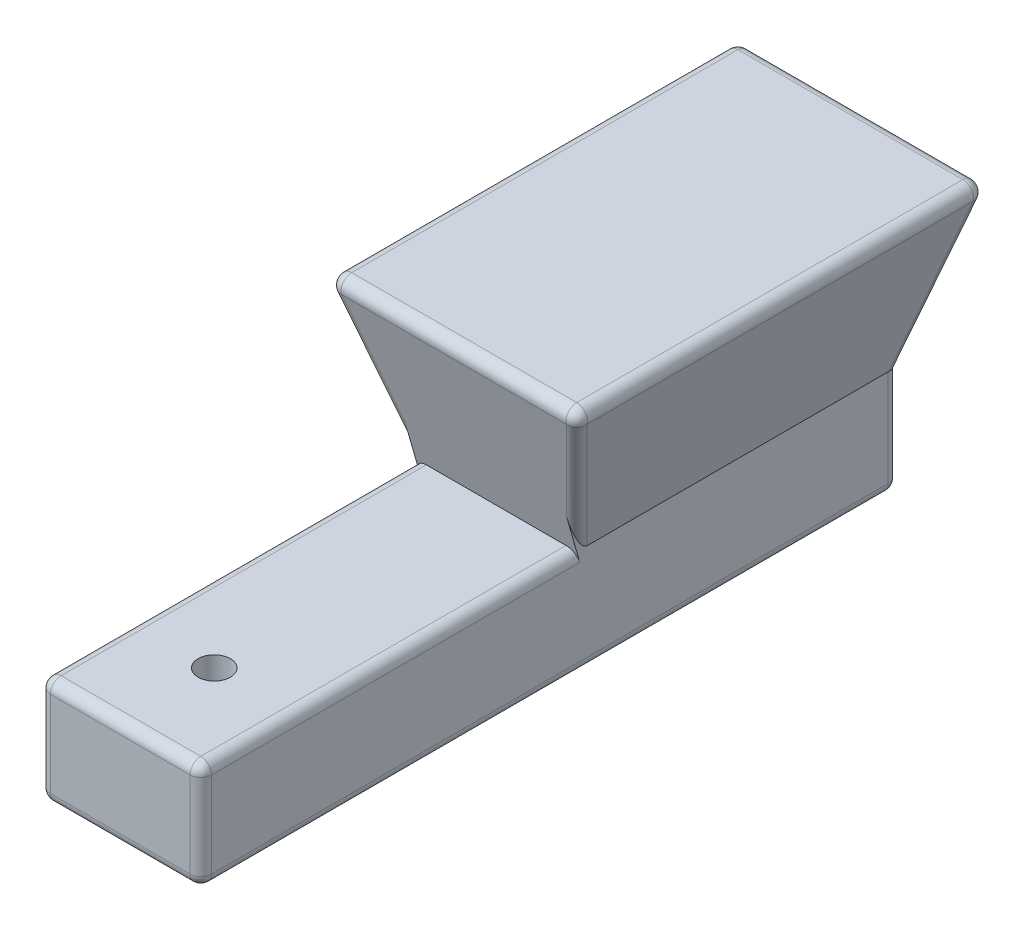
ISO-10303-21;
HEADER;
FILE_DESCRIPTION(('STEP AP214'),'2;1');
FILE_NAME('part.step','',(''),(''),'','','');
FILE_SCHEMA(('AUTOMOTIVE_DESIGN { 1 0 10303 214 1 1 1 1 }'));
ENDSEC;
DATA;
#1=APPLICATION_CONTEXT('core data for automotive mechanical design processes');
#2=APPLICATION_PROTOCOL_DEFINITION('international standard','automotive_design',2000,#1);
#3=PRODUCT_CONTEXT('',#1,'mechanical');
#4=PRODUCT('Part','Part','',(#3));
#5=PRODUCT_RELATED_PRODUCT_CATEGORY('part','',(#4));
#6=PRODUCT_DEFINITION_FORMATION('','',#4);
#7=PRODUCT_DEFINITION_CONTEXT('part definition',#1,'design');
#8=PRODUCT_DEFINITION('design','',#6,#7);
#9=PRODUCT_DEFINITION_SHAPE('','',#8);
#10=(LENGTH_UNIT() NAMED_UNIT(*) SI_UNIT(.MILLI.,.METRE.));
#11=(NAMED_UNIT(*) PLANE_ANGLE_UNIT() SI_UNIT($,.RADIAN.));
#12=(NAMED_UNIT(*) SI_UNIT($,.STERADIAN.) SOLID_ANGLE_UNIT());
#13=UNCERTAINTY_MEASURE_WITH_UNIT(LENGTH_MEASURE(1.E-05),#10,'distance_accuracy_value','');
#14=(GEOMETRIC_REPRESENTATION_CONTEXT(3) GLOBAL_UNCERTAINTY_ASSIGNED_CONTEXT((#13)) GLOBAL_UNIT_ASSIGNED_CONTEXT((#10,
#11,#12)) REPRESENTATION_CONTEXT('',''));
#15=CARTESIAN_POINT('',(0.,0.,0.));
#16=DIRECTION('',(0.,0.,1.));
#17=DIRECTION('',(1.,0.,0.));
#18=AXIS2_PLACEMENT_3D('',#15,#16,#17);
#19=CARTESIAN_POINT('',(-37.3094170403588,10.,-55.4260089686099));
#20=DIRECTION('',(1.,0.,0.));
#21=DIRECTION('',(0.,0.,-1.));
#22=AXIS2_PLACEMENT_3D('',#19,#20,#21);
#23=PLANE('',#22);
#24=DIRECTION('',(0.,0.,1.));
#25=VECTOR('',#24,1.);
#26=CARTESIAN_POINT('',(-37.3094170403588,0.999999999999999,-55.4260089686099));
#27=LINE('',#26,#25);
#28=CARTESIAN_POINT('',(-37.3094170403588,0.999999999999999,-54.4260089686099));
#29=VERTEX_POINT('',#28);
#30=CARTESIAN_POINT('',(-37.3094170403588,0.999999999999999,8.57399103139013));
#31=VERTEX_POINT('',#30);
#32=EDGE_CURVE('E344',#29,#31,#27,.T.);
#33=ORIENTED_EDGE('',*,*,#32,.T.);
#34=DIRECTION('',(0.,-1.,0.));
#35=VECTOR('',#34,1.);
#36=CARTESIAN_POINT('',(-37.3094170403588,10.,8.57399103139013));
#37=LINE('',#36,#35);
#38=CARTESIAN_POINT('',(-37.3094170403588,9.,8.57399103139013));
#39=VERTEX_POINT('',#38);
#40=EDGE_CURVE('E346',#31,#39,#37,.F.);
#41=ORIENTED_EDGE('',*,*,#40,.T.);
#42=DIRECTION('',(0.,0.,1.));
#43=VECTOR('',#42,1.);
#44=CARTESIAN_POINT('',(-37.3094170403588,9.,-25.4260089686099));
#45=LINE('',#44,#43);
#46=CARTESIAN_POINT('',(-37.3094170403588,9.,-25.7127543543687));
#47=VERTEX_POINT('',#46);
#48=EDGE_CURVE('E403',#39,#47,#45,.F.);
#49=ORIENTED_EDGE('',*,*,#48,.T.);
#50=DIRECTION('',(0.,-0.961261695938319,-0.275637355816999));
#51=VECTOR('',#50,1.);
#52=CARTESIAN_POINT('',(-37.3094170403588,2.05121103650192,-27.7052875262635));
#53=LINE('',#52,#51);
#54=CARTESIAN_POINT('',(-37.3094170403588,13.3523179227263,-24.4647472726715));
#55=VERTEX_POINT('',#54);
#56=EDGE_CURVE('E401',#47,#55,#53,.F.);
#57=ORIENTED_EDGE('',*,*,#56,.T.);
#58=CARTESIAN_POINT('',(-37.3094170403588,13.6279552785433,-25.4260089686099));
#59=DIRECTION('',(1.,0.,0.));
#60=DIRECTION('',(0.,-0.961261695938319,-0.275637355816999));
#61=AXIS2_PLACEMENT_3D('',#58,#59,#60);
#62=ELLIPSE('',#61,3.76325118788398,1.);
#63=CARTESIAN_POINT('',(-37.3094170403588,10.,-26.3872706645482));
#64=VERTEX_POINT('',#63);
#65=EDGE_CURVE('E51',#55,#64,#62,.T.);
#66=ORIENTED_EDGE('',*,*,#65,.T.);
#67=DIRECTION('',(0.,0.,1.));
#68=VECTOR('',#67,1.);
#69=CARTESIAN_POINT('',(-37.3094170403588,10.,-55.4260089686099));
#70=LINE('',#69,#68);
#71=CARTESIAN_POINT('',(-37.3094170403588,10.,-54.4260089686099));
#72=VERTEX_POINT('',#71);
#73=EDGE_CURVE('E437',#72,#64,#70,.T.);
#74=ORIENTED_EDGE('',*,*,#73,.F.);
#75=DIRECTION('',(0.,-1.,0.));
#76=VECTOR('',#75,1.);
#77=CARTESIAN_POINT('',(-37.3094170403588,10.,-54.4260089686099));
#78=LINE('',#77,#76);
#79=EDGE_CURVE('E306',#72,#29,#78,.T.);
#80=ORIENTED_EDGE('',*,*,#79,.T.);
#81=EDGE_LOOP('',(#33,#41,#49,#57,#66,#74,#80));
#82=FACE_BOUND('',#81,.T.);
#83=ADVANCED_FACE('F42',(#82),#23,.F.);
#84=CARTESIAN_POINT('',(-37.3094170403588,10.,9.57399103139013));
#85=DIRECTION('',(0.,0.,-1.));
#86=DIRECTION('',(-1.,0.,0.));
#87=AXIS2_PLACEMENT_3D('',#84,#85,#86);
#88=PLANE('',#87);
#89=DIRECTION('',(1.,0.,0.));
#90=VECTOR('',#89,1.);
#91=CARTESIAN_POINT('',(-37.3094170403588,9.,9.57399103139013));
#92=LINE('',#91,#90);
#93=CARTESIAN_POINT('',(-23.3094170403588,9.,9.57399103139013));
#94=VERTEX_POINT('',#93);
#95=CARTESIAN_POINT('',(-36.3094170403588,9.,9.57399103139013));
#96=VERTEX_POINT('',#95);
#97=EDGE_CURVE('E398',#94,#96,#92,.F.);
#98=ORIENTED_EDGE('',*,*,#97,.T.);
#99=DIRECTION('',(0.,-1.,0.));
#100=VECTOR('',#99,1.);
#101=CARTESIAN_POINT('',(-36.3094170403588,10.,9.57399103139013));
#102=LINE('',#101,#100);
#103=CARTESIAN_POINT('',(-36.3094170403588,0.999999999999999,9.57399103139013));
#104=VERTEX_POINT('',#103);
#105=EDGE_CURVE('E342',#96,#104,#102,.T.);
#106=ORIENTED_EDGE('',*,*,#105,.T.);
#107=DIRECTION('',(1.,0.,0.));
#108=VECTOR('',#107,1.);
#109=CARTESIAN_POINT('',(-37.3094170403588,0.999999999999999,9.57399103139013));
#110=LINE('',#109,#108);
#111=CARTESIAN_POINT('',(-23.3094170403588,0.999999999999999,9.57399103139013));
#112=VERTEX_POINT('',#111);
#113=EDGE_CURVE('E340',#104,#112,#110,.T.);
#114=ORIENTED_EDGE('',*,*,#113,.T.);
#115=DIRECTION('',(0.,-1.,0.));
#116=VECTOR('',#115,1.);
#117=CARTESIAN_POINT('',(-23.3094170403588,10.,9.57399103139013));
#118=LINE('',#117,#116);
#119=EDGE_CURVE('E302',#112,#94,#118,.F.);
#120=ORIENTED_EDGE('',*,*,#119,.T.);
#121=EDGE_LOOP('',(#98,#106,#114,#120));
#122=FACE_BOUND('',#121,.T.);
#123=ADVANCED_FACE('F470',(#122),#88,.F.);
#124=CARTESIAN_POINT('',(-22.3094170403588,10.,-55.4260089686099));
#125=DIRECTION('',(-1.,0.,0.));
#126=DIRECTION('',(0.,0.,1.));
#127=AXIS2_PLACEMENT_3D('',#124,#125,#126);
#128=PLANE('',#127);
#129=DIRECTION('',(0.,0.,-1.));
#130=VECTOR('',#129,1.);
#131=CARTESIAN_POINT('',(-22.3094170403588,0.999999999999999,-55.4260089686099));
#132=LINE('',#131,#130);
#133=CARTESIAN_POINT('',(-22.3094170403588,0.999999999999999,8.57399103139013));
#134=VERTEX_POINT('',#133);
#135=CARTESIAN_POINT('',(-22.3094170403588,0.999999999999999,-54.4260089686099));
#136=VERTEX_POINT('',#135);
#137=EDGE_CURVE('E417',#134,#136,#132,.T.);
#138=ORIENTED_EDGE('',*,*,#137,.T.);
#139=DIRECTION('',(0.,-1.,0.));
#140=VECTOR('',#139,1.);
#141=CARTESIAN_POINT('',(-22.3094170403588,10.,-54.4260089686099));
#142=LINE('',#141,#140);
#143=CARTESIAN_POINT('',(-22.3094170403588,10.,-54.4260089686099));
#144=VERTEX_POINT('',#143);
#145=EDGE_CURVE('E419',#136,#144,#142,.F.);
#146=ORIENTED_EDGE('',*,*,#145,.T.);
#147=DIRECTION('',(0.,0.,-1.));
#148=VECTOR('',#147,1.);
#149=CARTESIAN_POINT('',(-22.3094170403588,10.,-55.4260089686099));
#150=LINE('',#149,#148);
#151=CARTESIAN_POINT('',(-22.3094170403588,10.,-26.3872706645482));
#152=VERTEX_POINT('',#151);
#153=EDGE_CURVE('E1043',#152,#144,#150,.T.);
#154=ORIENTED_EDGE('',*,*,#153,.F.);
#155=CARTESIAN_POINT('',(-22.3094170403588,13.6279552785433,-25.4260089686099));
#156=DIRECTION('',(-1.,0.,0.));
#157=DIRECTION('',(0.,-0.961261695938319,-0.275637355816999));
#158=AXIS2_PLACEMENT_3D('',#155,#156,#157);
#159=ELLIPSE('',#158,3.76325118788398,1.);
#160=CARTESIAN_POINT('',(-22.3094170403588,13.3523179227263,-24.4647472726716));
#161=VERTEX_POINT('',#160);
#162=EDGE_CURVE('E267',#152,#161,#159,.T.);
#163=ORIENTED_EDGE('',*,*,#162,.T.);
#164=DIRECTION('',(0.,0.961261695938319,0.275637355816999));
#165=VECTOR('',#164,1.);
#166=CARTESIAN_POINT('',(-22.3094170403588,2.05121103650192,-27.7052875262635));
#167=LINE('',#166,#165);
#168=CARTESIAN_POINT('',(-22.3094170403588,9.,-25.7127543543687));
#169=VERTEX_POINT('',#168);
#170=EDGE_CURVE('E395',#161,#169,#167,.F.);
#171=ORIENTED_EDGE('',*,*,#170,.T.);
#172=DIRECTION('',(0.,0.,-1.));
#173=VECTOR('',#172,1.);
#174=CARTESIAN_POINT('',(-22.3094170403588,9.,9.57399103139013));
#175=LINE('',#174,#173);
#176=CARTESIAN_POINT('',(-22.3094170403588,9.,8.57399103139013));
#177=VERTEX_POINT('',#176);
#178=EDGE_CURVE('E392',#169,#177,#175,.F.);
#179=ORIENTED_EDGE('',*,*,#178,.T.);
#180=DIRECTION('',(0.,-1.,0.));
#181=VECTOR('',#180,1.);
#182=CARTESIAN_POINT('',(-22.3094170403588,10.,8.57399103139013));
#183=LINE('',#182,#181);
#184=EDGE_CURVE('E414',#177,#134,#183,.T.);
#185=ORIENTED_EDGE('',*,*,#184,.T.);
#186=EDGE_LOOP('',(#138,#146,#154,#163,#171,#179,#185));
#187=FACE_BOUND('',#186,.T.);
#188=ADVANCED_FACE('F496',(#187),#128,.F.);
#189=CARTESIAN_POINT('',(-37.3094170403588,10.,-55.4260089686099));
#190=DIRECTION('',(0.,0.,1.));
#191=DIRECTION('',(1.,0.,0.));
#192=AXIS2_PLACEMENT_3D('',#189,#190,#191);
#193=PLANE('',#192);
#194=DIRECTION('',(-1.,0.,0.));
#195=VECTOR('',#194,1.);
#196=CARTESIAN_POINT('',(-37.3094170403588,0.999999999999999,-55.4260089686099));
#197=LINE('',#196,#195);
#198=CARTESIAN_POINT('',(-23.3094170403588,0.999999999999999,-55.4260089686099));
#199=VERTEX_POINT('',#198);
#200=CARTESIAN_POINT('',(-36.3094170403588,0.999999999999999,-55.4260089686099));
#201=VERTEX_POINT('',#200);
#202=EDGE_CURVE('E429',#199,#201,#197,.T.);
#203=ORIENTED_EDGE('',*,*,#202,.T.);
#204=DIRECTION('',(0.,-1.,0.));
#205=VECTOR('',#204,1.);
#206=CARTESIAN_POINT('',(-36.3094170403588,10.,-55.4260089686099));
#207=LINE('',#206,#205);
#208=CARTESIAN_POINT('',(-36.3094170403588,10.,-55.4260089686099));
#209=VERTEX_POINT('',#208);
#210=EDGE_CURVE('E432',#201,#209,#207,.F.);
#211=ORIENTED_EDGE('',*,*,#210,.T.);
#212=DIRECTION('',(-1.,0.,0.));
#213=VECTOR('',#212,1.);
#214=CARTESIAN_POINT('',(-37.3094170403588,10.,-55.4260089686099));
#215=LINE('',#214,#213);
#216=CARTESIAN_POINT('',(-23.3094170403588,10.,-55.4260089686099));
#217=VERTEX_POINT('',#216);
#218=EDGE_CURVE('E231',#217,#209,#215,.T.);
#219=ORIENTED_EDGE('',*,*,#218,.F.);
#220=DIRECTION('',(0.,-1.,0.));
#221=VECTOR('',#220,1.);
#222=CARTESIAN_POINT('',(-23.3094170403588,10.,-55.4260089686099));
#223=LINE('',#222,#221);
#224=EDGE_CURVE('E427',#217,#199,#223,.T.);
#225=ORIENTED_EDGE('',*,*,#224,.T.);
#226=EDGE_LOOP('',(#203,#211,#219,#225));
#227=FACE_BOUND('',#226,.T.);
#228=ADVANCED_FACE('F509',(#227),#193,.F.);
#229=CARTESIAN_POINT('',(0.,10.,0.));
#230=DIRECTION('',(0.,1.,0.));
#231=DIRECTION('',(0.,0.,1.));
#232=AXIS2_PLACEMENT_3D('',#229,#230,#231);
#233=PLANE('',#232);
#234=DIRECTION('',(1.,0.,0.));
#235=VECTOR('',#234,1.);
#236=CARTESIAN_POINT('',(-22.3094170403588,10.,8.57399103139013));
#237=LINE('',#236,#235);
#238=CARTESIAN_POINT('',(-36.3094170403588,10.,8.57399103139013));
#239=VERTEX_POINT('',#238);
#240=CARTESIAN_POINT('',(-23.3094170403588,10.,8.57399103139013));
#241=VERTEX_POINT('',#240);
#242=EDGE_CURVE('E386',#239,#241,#237,.T.);
#243=ORIENTED_EDGE('',*,*,#242,.T.);
#244=DIRECTION('',(0.,0.,-1.));
#245=VECTOR('',#244,1.);
#246=CARTESIAN_POINT('',(-23.3094170403588,10.,-25.4260089686099));
#247=LINE('',#246,#245);
#248=CARTESIAN_POINT('',(-23.3094170403588,10.,-25.4260089686099));
#249=VERTEX_POINT('',#248);
#250=EDGE_CURVE('E389',#241,#249,#247,.T.);
#251=ORIENTED_EDGE('',*,*,#250,.T.);
#252=DIRECTION('',(1.,0.,0.));
#253=VECTOR('',#252,1.);
#254=CARTESIAN_POINT('',(-37.3094170403588,10.,-25.4260089686099));
#255=LINE('',#254,#253);
#256=CARTESIAN_POINT('',(-36.3094170403588,10.,-25.4260089686099));
#257=VERTEX_POINT('',#256);
#258=EDGE_CURVE('E327',#257,#249,#255,.T.);
#259=ORIENTED_EDGE('',*,*,#258,.F.);
#260=DIRECTION('',(0.,0.,1.));
#261=VECTOR('',#260,1.);
#262=CARTESIAN_POINT('',(-36.3094170403588,10.,9.57399103139013));
#263=LINE('',#262,#261);
#264=EDGE_CURVE('E383',#257,#239,#263,.T.);
#265=ORIENTED_EDGE('',*,*,#264,.T.);
#266=EDGE_LOOP('',(#243,#251,#259,#265));
#267=FACE_BOUND('',#266,.T.);
#268=CARTESIAN_POINT('',(-29.8094170403588,10.,0.82399103139013));
#269=DIRECTION('',(0.,1.,0.));
#270=DIRECTION('',(0.,0.,1.));
#271=AXIS2_PLACEMENT_3D('',#268,#269,#270);
#272=CIRCLE('',#271,1.5);
#273=CARTESIAN_POINT('',(-29.8094170403588,10.,2.32399103139013));
#274=VERTEX_POINT('',#273);
#275=EDGE_CURVE('E1040',#274,#274,#272,.T.);
#276=ORIENTED_EDGE('',*,*,#275,.F.);
#277=EDGE_LOOP('',(#276));
#278=FACE_BOUND('',#277,.T.);
#279=ADVANCED_FACE('F939',(#267,#278),#233,.T.);
#280=CARTESIAN_POINT('',(0.,0.,0.));
#281=DIRECTION('',(0.,1.,0.));
#282=DIRECTION('',(0.,0.,1.));
#283=AXIS2_PLACEMENT_3D('',#280,#281,#282);
#284=PLANE('',#283);
#285=CARTESIAN_POINT('',(-29.8094170403588,0.,0.82399103139013));
#286=DIRECTION('',(0.,1.,0.));
#287=DIRECTION('',(0.,0.,1.));
#288=AXIS2_PLACEMENT_3D('',#285,#286,#287);
#289=CIRCLE('',#288,1.5);
#290=CARTESIAN_POINT('',(-29.8094170403588,0.,2.32399103139013));
#291=VERTEX_POINT('',#290);
#292=EDGE_CURVE('E1042',#291,#291,#289,.T.);
#293=ORIENTED_EDGE('',*,*,#292,.T.);
#294=EDGE_LOOP('',(#293));
#295=FACE_BOUND('',#294,.T.);
#296=DIRECTION('',(0.,0.,-1.));
#297=VECTOR('',#296,1.);
#298=CARTESIAN_POINT('',(-23.3094170403588,0.,0.));
#299=LINE('',#298,#297);
#300=CARTESIAN_POINT('',(-23.3094170403588,0.,-54.4260089686099));
#301=VERTEX_POINT('',#300);
#302=CARTESIAN_POINT('',(-23.3094170403588,0.,8.57399103139013));
#303=VERTEX_POINT('',#302);
#304=EDGE_CURVE('E424',#301,#303,#299,.F.);
#305=ORIENTED_EDGE('',*,*,#304,.T.);
#306=DIRECTION('',(1.,0.,0.));
#307=VECTOR('',#306,1.);
#308=CARTESIAN_POINT('',(0.,0.,8.57399103139013));
#309=LINE('',#308,#307);
#310=CARTESIAN_POINT('',(-36.3094170403588,0.,8.57399103139013));
#311=VERTEX_POINT('',#310);
#312=EDGE_CURVE('E350',#303,#311,#309,.F.);
#313=ORIENTED_EDGE('',*,*,#312,.T.);
#314=DIRECTION('',(0.,0.,1.));
#315=VECTOR('',#314,1.);
#316=CARTESIAN_POINT('',(-36.3094170403588,0.,0.));
#317=LINE('',#316,#315);
#318=CARTESIAN_POINT('',(-36.3094170403588,0.,-54.4260089686099));
#319=VERTEX_POINT('',#318);
#320=EDGE_CURVE('E348',#311,#319,#317,.F.);
#321=ORIENTED_EDGE('',*,*,#320,.T.);
#322=DIRECTION('',(-1.,0.,0.));
#323=VECTOR('',#322,1.);
#324=CARTESIAN_POINT('',(0.,0.,-54.4260089686099));
#325=LINE('',#324,#323);
#326=EDGE_CURVE('E422',#319,#301,#325,.F.);
#327=ORIENTED_EDGE('',*,*,#326,.T.);
#328=EDGE_LOOP('',(#305,#313,#321,#327));
#329=FACE_BOUND('',#328,.T.);
#330=ADVANCED_FACE('F486',(#295,#329),#284,.F.);
#331=CARTESIAN_POINT('',(-29.8094170403588,0.,0.82399103139013));
#332=DIRECTION('',(0.,1.,0.));
#333=DIRECTION('',(0.,0.,1.));
#334=AXIS2_PLACEMENT_3D('',#331,#332,#333);
#335=CYLINDRICAL_SURFACE('',#334,1.5);
#336=ORIENTED_EDGE('',*,*,#292,.F.);
#337=EDGE_LOOP('',(#336));
#338=FACE_BOUND('',#337,.T.);
#339=ORIENTED_EDGE('',*,*,#275,.T.);
#340=EDGE_LOOP('',(#339));
#341=FACE_BOUND('',#340,.T.);
#342=ADVANCED_FACE('F918',(#338,#341),#335,.F.);
#343=CARTESIAN_POINT('',(-37.3094170403588,10.,-55.4260089686099));
#344=DIRECTION('',(-0.961261695938319,-0.275637355816999,0.));
#345=DIRECTION('',(0.275637355816999,-0.961261695938319,0.));
#346=AXIS2_PLACEMENT_3D('',#343,#344,#345);
#347=PLANE('',#346);
#348=ORIENTED_EDGE('',*,*,#73,.T.);
#349=DIRECTION('',(-0.265727678029987,0.926702542490083,0.265727678029987));
#350=VECTOR('',#349,1.);
#351=CARTESIAN_POINT('',(-35.2589569150017,2.8491957423099,-28.4377307899053));
#352=LINE('',#351,#350);
#353=CARTESIAN_POINT('',(-41.2448147010588,23.724362644183,-22.4518730038482));
#354=VERTEX_POINT('',#353);
#355=EDGE_CURVE('E263',#64,#354,#352,.T.);
#356=ORIENTED_EDGE('',*,*,#355,.T.);
#357=DIRECTION('',(0.,0.,1.));
#358=VECTOR('',#357,1.);
#359=CARTESIAN_POINT('',(-41.2448147010588,23.724362644183,-59.727189754992));
#360=LINE('',#359,#358);
#361=CARTESIAN_POINT('',(-41.2448147010588,23.724362644183,-58.4001449333716));
#362=VERTEX_POINT('',#361);
#363=EDGE_CURVE('E376',#354,#362,#360,.F.);
#364=ORIENTED_EDGE('',*,*,#363,.T.);
#365=DIRECTION('',(-0.265727678029987,0.926702542490083,-0.265727678029987));
#366=VECTOR('',#365,1.);
#367=CARTESIAN_POINT('',(-37.3772928811379,10.2367111875211,-54.5326231134507));
#368=LINE('',#367,#366);
#369=CARTESIAN_POINT('',(-37.3086941916797,9.99747912707586,-54.4640244239925));
#370=VERTEX_POINT('',#369);
#371=EDGE_CURVE('E66',#362,#370,#368,.F.);
#372=ORIENTED_EDGE('',*,*,#371,.T.);
#373=CARTESIAN_POINT('',(-36.3094170403588,6.51258555615909,-54.4260089686099));
#374=DIRECTION('',(-0.961261695938319,-0.275637355816999,0.));
#375=DIRECTION('',(0.275637355816999,-0.961261695938319,0.));
#376=AXIS2_PLACEMENT_3D('',#373,#374,#375);
#377=ELLIPSE('',#376,3.6279552785433,1.);
#378=EDGE_CURVE('E295',#370,#72,#377,.F.);
#379=ORIENTED_EDGE('',*,*,#378,.T.);
#380=EDGE_LOOP('',(#348,#356,#364,#372,#379));
#381=FACE_BOUND('',#380,.T.);
#382=ADVANCED_FACE('F906',(#381),#347,.T.);
#383=CARTESIAN_POINT('',(-37.3094170403588,10.,-25.4260089686099));
#384=DIRECTION('',(0.,-0.275637355816999,0.961261695938319));
#385=DIRECTION('',(0.,-0.961261695938319,-0.275637355816999));
#386=AXIS2_PLACEMENT_3D('',#383,#384,#385);
#387=PLANE('',#386);
#388=ORIENTED_EDGE('',*,*,#170,.F.);
#389=DIRECTION('',(0.265727678029987,0.926702542490083,0.265727678029987));
#390=VECTOR('',#389,1.);
#391=CARTESIAN_POINT('',(-24.261970878586,6.54295346491552,-26.4173011108988));
#392=LINE('',#391,#390);
#393=CARTESIAN_POINT('',(-19.335281075597,23.724362644183,-21.4906113079098));
#394=VERTEX_POINT('',#393);
#395=EDGE_CURVE('E260',#161,#394,#392,.T.);
#396=ORIENTED_EDGE('',*,*,#395,.T.);
#397=DIRECTION('',(1.,0.,0.));
#398=VECTOR('',#397,1.);
#399=CARTESIAN_POINT('',(-41.6105978267409,23.724362644183,-21.4906113079098));
#400=LINE('',#399,#398);
#401=CARTESIAN_POINT('',(-40.2835530051205,23.724362644183,-21.4906113079098));
#402=VERTEX_POINT('',#401);
#403=EDGE_CURVE('E205',#394,#402,#400,.F.);
#404=ORIENTED_EDGE('',*,*,#403,.T.);
#405=DIRECTION('',(-0.265727678029987,0.926702542490083,0.265727678029987));
#406=VECTOR('',#405,1.);
#407=CARTESIAN_POINT('',(-36.4160311851996,10.2367111875211,-25.3581331278307));
#408=LINE('',#407,#406);
#409=EDGE_CURVE('E257',#402,#55,#408,.F.);
#410=ORIENTED_EDGE('',*,*,#409,.T.);
#411=ORIENTED_EDGE('',*,*,#56,.F.);
#412=CARTESIAN_POINT('',(-36.3094170403588,9.,-25.7127543543687));
#413=DIRECTION('',(0.,-0.275637355816999,0.961261695938319));
#414=DIRECTION('',(0.,-0.961261695938319,-0.275637355816999));
#415=AXIS2_PLACEMENT_3D('',#412,#413,#414);
#416=ELLIPSE('',#415,1.0402994358616,1.);
#417=EDGE_CURVE('E407',#47,#257,#416,.F.);
#418=ORIENTED_EDGE('',*,*,#417,.T.);
#419=ORIENTED_EDGE('',*,*,#258,.T.);
#420=CARTESIAN_POINT('',(-23.3094170403588,9.,-25.7127543543687));
#421=DIRECTION('',(0.,-0.275637355816999,0.961261695938319));
#422=DIRECTION('',(0.,0.961261695938319,0.275637355816999));
#423=AXIS2_PLACEMENT_3D('',#420,#421,#422);
#424=ELLIPSE('',#423,1.0402994358616,1.);
#425=EDGE_CURVE('E405',#249,#169,#424,.F.);
#426=ORIENTED_EDGE('',*,*,#425,.T.);
#427=EDGE_LOOP('',(#388,#396,#404,#410,#411,#418,#419,#426));
#428=FACE_BOUND('',#427,.T.);
#429=ADVANCED_FACE('F895',(#428),#387,.T.);
#430=CARTESIAN_POINT('',(-22.3094170403588,10.,-55.4260089686099));
#431=DIRECTION('',(0.961261695938319,-0.275637355816999,0.));
#432=DIRECTION('',(0.275637355816999,0.961261695938319,0.));
#433=AXIS2_PLACEMENT_3D('',#430,#431,#432);
#434=PLANE('',#433);
#435=CARTESIAN_POINT('',(-23.3094170403588,6.51258555615908,-54.4260089686099));
#436=DIRECTION('',(0.961261695938319,-0.275637355816999,0.));
#437=DIRECTION('',(-0.275637355816999,-0.961261695938319,0.));
#438=AXIS2_PLACEMENT_3D('',#435,#436,#437);
#439=ELLIPSE('',#438,3.6279552785433,1.);
#440=CARTESIAN_POINT('',(-22.3101398890378,9.99747912707585,-54.4640244239925));
#441=VERTEX_POINT('',#440);
#442=EDGE_CURVE('E304',#144,#441,#439,.F.);
#443=ORIENTED_EDGE('',*,*,#442,.T.);
#444=DIRECTION('',(0.265727678029987,0.926702542490083,-0.265727678029987));
#445=VECTOR('',#444,1.);
#446=CARTESIAN_POINT('',(-22.2415411995796,10.2367111875211,-54.5326231134507));
#447=LINE('',#446,#445);
#448=CARTESIAN_POINT('',(-18.3740193796587,23.724362644183,-58.4001449333716));
#449=VERTEX_POINT('',#448);
#450=EDGE_CURVE('E255',#441,#449,#447,.T.);
#451=ORIENTED_EDGE('',*,*,#450,.T.);
#452=DIRECTION('',(0.,0.,-1.));
#453=VECTOR('',#452,1.);
#454=CARTESIAN_POINT('',(-18.3740193796587,23.724362644183,-21.1248281822278));
#455=LINE('',#454,#453);
#456=CARTESIAN_POINT('',(-18.3740193796587,23.724362644183,-22.4518730038482));
#457=VERTEX_POINT('',#456);
#458=EDGE_CURVE('E381',#449,#457,#455,.F.);
#459=ORIENTED_EDGE('',*,*,#458,.T.);
#460=DIRECTION('',(0.265727678029987,0.926702542490083,0.265727678029987));
#461=VECTOR('',#460,1.);
#462=CARTESIAN_POINT('',(-24.3598771657158,2.8491957423099,-28.4377307899053));
#463=LINE('',#462,#461);
#464=EDGE_CURVE('E253',#457,#152,#463,.F.);
#465=ORIENTED_EDGE('',*,*,#464,.T.);
#466=ORIENTED_EDGE('',*,*,#153,.T.);
#467=EDGE_LOOP('',(#443,#451,#459,#465,#466));
#468=FACE_BOUND('',#467,.T.);
#469=ADVANCED_FACE('F518',(#468),#434,.T.);
#470=CARTESIAN_POINT('',(-37.3094170403588,10.,-55.4260089686099));
#471=DIRECTION('',(0.,-0.275637355816999,-0.961261695938319));
#472=DIRECTION('',(0.,0.961261695938319,-0.275637355816999));
#473=AXIS2_PLACEMENT_3D('',#470,#471,#472);
#474=PLANE('',#473);
#475=DIRECTION('',(-1.,0.,0.));
#476=VECTOR('',#475,1.);
#477=CARTESIAN_POINT('',(-18.0082362539766,23.724362644183,-59.3614066293099));
#478=LINE('',#477,#476);
#479=CARTESIAN_POINT('',(-40.2835530051205,23.724362644183,-59.3614066293099));
#480=VERTEX_POINT('',#479);
#481=CARTESIAN_POINT('',(-19.335281075597,23.724362644183,-59.3614066293099));
#482=VERTEX_POINT('',#481);
#483=EDGE_CURVE('E370',#480,#482,#478,.F.);
#484=ORIENTED_EDGE('',*,*,#483,.T.);
#485=DIRECTION('',(0.265727678029987,0.926702542490083,-0.265727678029987));
#486=VECTOR('',#485,1.);
#487=CARTESIAN_POINT('',(-24.261970878586,6.54295346491552,-54.4347168263209));
#488=LINE('',#487,#486);
#489=CARTESIAN_POINT('',(-23.2714015849762,9.99747912707586,-55.4252861199308));
#490=VERTEX_POINT('',#489);
#491=EDGE_CURVE('E251',#482,#490,#488,.F.);
#492=ORIENTED_EDGE('',*,*,#491,.T.);
#493=CARTESIAN_POINT('',(-23.3094170403588,6.51258555615909,-54.4260089686099));
#494=DIRECTION('',(0.,-0.275637355816999,-0.961261695938319));
#495=DIRECTION('',(0.,-0.961261695938319,0.275637355816999));
#496=AXIS2_PLACEMENT_3D('',#493,#494,#495);
#497=ELLIPSE('',#496,3.6279552785433,1.);
#498=EDGE_CURVE('E312',#490,#217,#497,.F.);
#499=ORIENTED_EDGE('',*,*,#498,.T.);
#500=ORIENTED_EDGE('',*,*,#218,.T.);
#501=CARTESIAN_POINT('',(-36.3094170403588,6.51258555615909,-54.4260089686099));
#502=DIRECTION('',(0.,-0.275637355816999,-0.961261695938319));
#503=DIRECTION('',(0.,-0.961261695938319,0.275637355816999));
#504=AXIS2_PLACEMENT_3D('',#501,#502,#503);
#505=ELLIPSE('',#504,3.6279552785433,1.);
#506=CARTESIAN_POINT('',(-36.3474324957414,9.99747912707586,-55.4252861199308));
#507=VERTEX_POINT('',#506);
#508=EDGE_CURVE('E293',#209,#507,#505,.F.);
#509=ORIENTED_EDGE('',*,*,#508,.T.);
#510=DIRECTION('',(-0.265727678029987,0.926702542490083,-0.265727678029987));
#511=VECTOR('',#510,1.);
#512=CARTESIAN_POINT('',(-36.4160311851996,10.2367111875211,-55.4938848093891));
#513=LINE('',#512,#511);
#514=EDGE_CURVE('E249',#507,#480,#513,.T.);
#515=ORIENTED_EDGE('',*,*,#514,.T.);
#516=EDGE_LOOP('',(#484,#492,#499,#500,#509,#515));
#517=FACE_BOUND('',#516,.T.);
#518=ADVANCED_FACE('F299',(#517),#474,.T.);
#519=CARTESIAN_POINT('',(0.,25.,0.));
#520=DIRECTION('',(0.,1.,0.));
#521=DIRECTION('',(0.,0.,1.));
#522=AXIS2_PLACEMENT_3D('',#519,#520,#521);
#523=PLANE('',#522);
#524=DIRECTION('',(0.,0.,1.));
#525=VECTOR('',#524,1.);
#526=CARTESIAN_POINT('',(-19.335281075597,25.,-59.727189754992));
#527=LINE('',#526,#525);
#528=CARTESIAN_POINT('',(-19.335281075597,25.,-22.4518730038482));
#529=VERTEX_POINT('',#528);
#530=CARTESIAN_POINT('',(-19.335281075597,25.,-58.4001449333716));
#531=VERTEX_POINT('',#530);
#532=EDGE_CURVE('E218',#529,#531,#527,.F.);
#533=ORIENTED_EDGE('',*,*,#532,.T.);
#534=DIRECTION('',(1.,0.,0.));
#535=VECTOR('',#534,1.);
#536=CARTESIAN_POINT('',(-41.6105978267409,25.,-58.4001449333716));
#537=LINE('',#536,#535);
#538=CARTESIAN_POINT('',(-40.2835530051205,25.,-58.4001449333716));
#539=VERTEX_POINT('',#538);
#540=EDGE_CURVE('E368',#531,#539,#537,.F.);
#541=ORIENTED_EDGE('',*,*,#540,.T.);
#542=DIRECTION('',(0.,0.,-1.));
#543=VECTOR('',#542,1.);
#544=CARTESIAN_POINT('',(-40.2835530051205,25.,-21.1248281822278));
#545=LINE('',#544,#543);
#546=CARTESIAN_POINT('',(-40.2835530051205,25.,-22.4518730038482));
#547=VERTEX_POINT('',#546);
#548=EDGE_CURVE('E221',#539,#547,#545,.F.);
#549=ORIENTED_EDGE('',*,*,#548,.T.);
#550=DIRECTION('',(-1.,0.,0.));
#551=VECTOR('',#550,1.);
#552=CARTESIAN_POINT('',(-18.0082362539766,25.,-22.4518730038482));
#553=LINE('',#552,#551);
#554=EDGE_CURVE('E203',#547,#529,#553,.F.);
#555=ORIENTED_EDGE('',*,*,#554,.T.);
#556=EDGE_LOOP('',(#533,#541,#549,#555));
#557=FACE_BOUND('',#556,.T.);
#558=ADVANCED_FACE('F216',(#557),#523,.T.);
#559=CARTESIAN_POINT('',(0.,24.,-22.4518730038482));
#560=DIRECTION('',(1.,0.,0.));
#561=DIRECTION('',(0.,0.,-1.));
#562=AXIS2_PLACEMENT_3D('',#559,#560,#561);
#563=CYLINDRICAL_SURFACE('',#562,1.);
#564=ORIENTED_EDGE('',*,*,#403,.F.);
#565=CARTESIAN_POINT('',(-19.335281075597,24.,-22.4518730038482));
#566=DIRECTION('',(1.,0.,0.));
#567=DIRECTION('',(0.,0.,-1.));
#568=AXIS2_PLACEMENT_3D('',#565,#566,#567);
#569=CIRCLE('',#568,1.);
#570=EDGE_CURVE('E200',#394,#529,#569,.F.);
#571=ORIENTED_EDGE('',*,*,#570,.T.);
#572=ORIENTED_EDGE('',*,*,#554,.F.);
#573=CARTESIAN_POINT('',(-40.2835530051205,24.,-22.4518730038482));
#574=DIRECTION('',(1.,0.,0.));
#575=DIRECTION('',(0.,0.,-1.));
#576=AXIS2_PLACEMENT_3D('',#573,#574,#575);
#577=CIRCLE('',#576,1.);
#578=EDGE_CURVE('E210',#547,#402,#577,.T.);
#579=ORIENTED_EDGE('',*,*,#578,.T.);
#580=EDGE_LOOP('',(#564,#571,#572,#579));
#581=FACE_BOUND('',#580,.T.);
#582=ADVANCED_FACE('F202',(#581),#563,.T.);
#583=CARTESIAN_POINT('',(-19.335281075597,24.,0.));
#584=DIRECTION('',(0.,0.,-1.));
#585=DIRECTION('',(-1.,0.,0.));
#586=AXIS2_PLACEMENT_3D('',#583,#584,#585);
#587=CYLINDRICAL_SURFACE('',#586,1.);
#588=ORIENTED_EDGE('',*,*,#458,.F.);
#589=CARTESIAN_POINT('',(-19.335281075597,24.,-58.4001449333716));
#590=DIRECTION('',(0.,0.,-1.));
#591=DIRECTION('',(-1.,0.,0.));
#592=AXIS2_PLACEMENT_3D('',#589,#590,#591);
#593=CIRCLE('',#592,1.);
#594=EDGE_CURVE('E230',#449,#531,#593,.F.);
#595=ORIENTED_EDGE('',*,*,#594,.T.);
#596=ORIENTED_EDGE('',*,*,#532,.F.);
#597=CARTESIAN_POINT('',(-19.335281075597,24.,-22.4518730038482));
#598=DIRECTION('',(0.,0.,-1.));
#599=DIRECTION('',(-1.,0.,0.));
#600=AXIS2_PLACEMENT_3D('',#597,#598,#599);
#601=CIRCLE('',#600,1.);
#602=EDGE_CURVE('E227',#529,#457,#601,.T.);
#603=ORIENTED_EDGE('',*,*,#602,.T.);
#604=EDGE_LOOP('',(#588,#595,#596,#603));
#605=FACE_BOUND('',#604,.T.);
#606=ADVANCED_FACE('F226',(#605),#587,.T.);
#607=CARTESIAN_POINT('',(-40.2835530051205,24.,0.));
#608=DIRECTION('',(0.,0.,1.));
#609=DIRECTION('',(1.,0.,0.));
#610=AXIS2_PLACEMENT_3D('',#607,#608,#609);
#611=CYLINDRICAL_SURFACE('',#610,1.);
#612=ORIENTED_EDGE('',*,*,#363,.F.);
#613=CARTESIAN_POINT('',(-40.2835530051205,24.,-22.4518730038482));
#614=DIRECTION('',(0.,0.,1.));
#615=DIRECTION('',(1.,0.,0.));
#616=AXIS2_PLACEMENT_3D('',#613,#614,#615);
#617=CIRCLE('',#616,1.);
#618=EDGE_CURVE('E246',#354,#547,#617,.F.);
#619=ORIENTED_EDGE('',*,*,#618,.T.);
#620=ORIENTED_EDGE('',*,*,#548,.F.);
#621=CARTESIAN_POINT('',(-40.2835530051205,24.,-58.4001449333716));
#622=DIRECTION('',(0.,0.,1.));
#623=DIRECTION('',(1.,0.,0.));
#624=AXIS2_PLACEMENT_3D('',#621,#622,#623);
#625=CIRCLE('',#624,1.);
#626=EDGE_CURVE('E209',#539,#362,#625,.T.);
#627=ORIENTED_EDGE('',*,*,#626,.T.);
#628=EDGE_LOOP('',(#612,#619,#620,#627));
#629=FACE_BOUND('',#628,.T.);
#630=ADVANCED_FACE('F373',(#629),#611,.T.);
#631=CARTESIAN_POINT('',(0.,24.,-58.4001449333716));
#632=DIRECTION('',(-1.,0.,0.));
#633=DIRECTION('',(0.,0.,1.));
#634=AXIS2_PLACEMENT_3D('',#631,#632,#633);
#635=CYLINDRICAL_SURFACE('',#634,1.);
#636=ORIENTED_EDGE('',*,*,#540,.F.);
#637=CARTESIAN_POINT('',(-19.335281075597,24.,-58.4001449333716));
#638=DIRECTION('',(-1.,0.,0.));
#639=DIRECTION('',(0.,0.,1.));
#640=AXIS2_PLACEMENT_3D('',#637,#638,#639);
#641=CIRCLE('',#640,1.);
#642=EDGE_CURVE('E236',#531,#482,#641,.T.);
#643=ORIENTED_EDGE('',*,*,#642,.T.);
#644=ORIENTED_EDGE('',*,*,#483,.F.);
#645=CARTESIAN_POINT('',(-40.2835530051205,24.,-58.4001449333716));
#646=DIRECTION('',(-1.,0.,0.));
#647=DIRECTION('',(0.,0.,1.));
#648=AXIS2_PLACEMENT_3D('',#645,#646,#647);
#649=CIRCLE('',#648,1.);
#650=EDGE_CURVE('E240',#480,#539,#649,.F.);
#651=ORIENTED_EDGE('',*,*,#650,.T.);
#652=EDGE_LOOP('',(#636,#643,#644,#651));
#653=FACE_BOUND('',#652,.T.);
#654=ADVANCED_FACE('F367',(#653),#635,.T.);
#655=CARTESIAN_POINT('',(-36.3094170403588,9.,0.));
#656=DIRECTION('',(0.,0.,-1.));
#657=DIRECTION('',(-1.,0.,0.));
#658=AXIS2_PLACEMENT_3D('',#655,#656,#657);
#659=CYLINDRICAL_SURFACE('',#658,1.);
#660=ORIENTED_EDGE('',*,*,#48,.F.);
#661=CARTESIAN_POINT('',(-36.3094170403588,9.,8.57399103139013));
#662=DIRECTION('',(0.,0.,-1.));
#663=DIRECTION('',(-1.,0.,0.));
#664=AXIS2_PLACEMENT_3D('',#661,#662,#663);
#665=CIRCLE('',#664,1.);
#666=EDGE_CURVE('E330',#39,#239,#665,.T.);
#667=ORIENTED_EDGE('',*,*,#666,.T.);
#668=ORIENTED_EDGE('',*,*,#264,.F.);
#669=ORIENTED_EDGE('',*,*,#417,.F.);
#670=EDGE_LOOP('',(#660,#667,#668,#669));
#671=FACE_BOUND('',#670,.T.);
#672=ADVANCED_FACE('F459',(#671),#659,.T.);
#673=CARTESIAN_POINT('',(0.,9.,8.57399103139013));
#674=DIRECTION('',(-1.,0.,0.));
#675=DIRECTION('',(0.,0.,1.));
#676=AXIS2_PLACEMENT_3D('',#673,#674,#675);
#677=CYLINDRICAL_SURFACE('',#676,1.);
#678=ORIENTED_EDGE('',*,*,#242,.F.);
#679=CARTESIAN_POINT('',(-36.3094170403588,9.,8.57399103139013));
#680=DIRECTION('',(-1.,0.,0.));
#681=DIRECTION('',(0.,0.,1.));
#682=AXIS2_PLACEMENT_3D('',#679,#680,#681);
#683=CIRCLE('',#682,1.);
#684=EDGE_CURVE('E314',#239,#96,#683,.F.);
#685=ORIENTED_EDGE('',*,*,#684,.T.);
#686=ORIENTED_EDGE('',*,*,#97,.F.);
#687=CARTESIAN_POINT('',(-23.3094170403588,9.,8.57399103139013));
#688=DIRECTION('',(-1.,0.,0.));
#689=DIRECTION('',(0.,0.,1.));
#690=AXIS2_PLACEMENT_3D('',#687,#688,#689);
#691=CIRCLE('',#690,1.);
#692=EDGE_CURVE('E412',#94,#241,#691,.T.);
#693=ORIENTED_EDGE('',*,*,#692,.T.);
#694=EDGE_LOOP('',(#678,#685,#686,#693));
#695=FACE_BOUND('',#694,.T.);
#696=ADVANCED_FACE('F467',(#695),#677,.T.);
#697=CARTESIAN_POINT('',(-23.3094170403588,9.,0.));
#698=DIRECTION('',(0.,0.,1.));
#699=DIRECTION('',(1.,0.,0.));
#700=AXIS2_PLACEMENT_3D('',#697,#698,#699);
#701=CYLINDRICAL_SURFACE('',#700,1.);
#702=ORIENTED_EDGE('',*,*,#250,.F.);
#703=CARTESIAN_POINT('',(-23.3094170403588,9.,8.57399103139013));
#704=DIRECTION('',(0.,0.,1.));
#705=DIRECTION('',(1.,0.,0.));
#706=AXIS2_PLACEMENT_3D('',#703,#704,#705);
#707=CIRCLE('',#706,1.);
#708=EDGE_CURVE('E409',#241,#177,#707,.F.);
#709=ORIENTED_EDGE('',*,*,#708,.T.);
#710=ORIENTED_EDGE('',*,*,#178,.F.);
#711=ORIENTED_EDGE('',*,*,#425,.F.);
#712=EDGE_LOOP('',(#702,#709,#710,#711));
#713=FACE_BOUND('',#712,.T.);
#714=ADVANCED_FACE('F548',(#713),#701,.T.);
#715=CARTESIAN_POINT('',(-36.3094170403588,10.,-54.4260089686099));
#716=DIRECTION('',(0.,-1.,0.));
#717=DIRECTION('',(0.,0.,-1.));
#718=AXIS2_PLACEMENT_3D('',#715,#716,#717);
#719=CYLINDRICAL_SURFACE('',#718,1.);
#720=ORIENTED_EDGE('',*,*,#210,.F.);
#721=CARTESIAN_POINT('',(-36.3094170403588,0.999999999999999,-54.4260089686099));
#722=DIRECTION('',(0.,-1.,0.));
#723=DIRECTION('',(0.,0.,-1.));
#724=AXIS2_PLACEMENT_3D('',#721,#722,#723);
#725=CIRCLE('',#724,1.);
#726=EDGE_CURVE('E338',#201,#29,#725,.F.);
#727=ORIENTED_EDGE('',*,*,#726,.T.);
#728=ORIENTED_EDGE('',*,*,#79,.F.);
#729=ORIENTED_EDGE('',*,*,#378,.F.);
#730=CARTESIAN_POINT('',(-36.3094170403588,10.1405408347024,-54.4260089686099));
#731=DIRECTION('',(0.135367515961103,-0.981504595631137,0.135367515961103));
#732=DIRECTION('',(0.694028555336537,0.191438576976948,0.694028555336537));
#733=AXIS2_PLACEMENT_3D('',#730,#731,#732);
#734=ELLIPSE('',#733,1.01884393048305,1.);
#735=EDGE_CURVE('E11',#370,#507,#734,.T.);
#736=ORIENTED_EDGE('',*,*,#735,.T.);
#737=ORIENTED_EDGE('',*,*,#508,.F.);
#738=EDGE_LOOP('',(#720,#727,#728,#729,#736,#737));
#739=FACE_BOUND('',#738,.T.);
#740=ADVANCED_FACE('F292',(#739),#719,.T.);
#741=CARTESIAN_POINT('',(-23.3094170403588,10.,-54.4260089686099));
#742=DIRECTION('',(0.,-1.,0.));
#743=DIRECTION('',(0.,0.,-1.));
#744=AXIS2_PLACEMENT_3D('',#741,#742,#743);
#745=CYLINDRICAL_SURFACE('',#744,1.);
#746=ORIENTED_EDGE('',*,*,#442,.F.);
#747=ORIENTED_EDGE('',*,*,#145,.F.);
#748=CARTESIAN_POINT('',(-23.3094170403588,0.999999999999999,-54.4260089686099));
#749=DIRECTION('',(0.,-1.,0.));
#750=DIRECTION('',(0.,0.,-1.));
#751=AXIS2_PLACEMENT_3D('',#748,#749,#750);
#752=CIRCLE('',#751,1.);
#753=EDGE_CURVE('E324',#199,#136,#752,.T.);
#754=ORIENTED_EDGE('',*,*,#753,.F.);
#755=ORIENTED_EDGE('',*,*,#224,.F.);
#756=ORIENTED_EDGE('',*,*,#498,.F.);
#757=CARTESIAN_POINT('',(-23.3094170403588,10.1405408347024,-54.4260089686099));
#758=DIRECTION('',(-0.135367515961103,-0.981504595631137,0.135367515961103));
#759=DIRECTION('',(-0.694028555336537,0.191438576976948,0.694028555336537));
#760=AXIS2_PLACEMENT_3D('',#757,#758,#759);
#761=ELLIPSE('',#760,1.01884393048305,1.);
#762=EDGE_CURVE('E265',#490,#441,#761,.T.);
#763=ORIENTED_EDGE('',*,*,#762,.T.);
#764=EDGE_LOOP('',(#746,#747,#754,#755,#756,#763));
#765=FACE_BOUND('',#764,.T.);
#766=ADVANCED_FACE('F501',(#765),#745,.T.);
#767=CARTESIAN_POINT('',(-37.3094170403588,0.999999999999999,-54.4260089686099));
#768=DIRECTION('',(-1.,0.,0.));
#769=DIRECTION('',(0.,0.,1.));
#770=AXIS2_PLACEMENT_3D('',#767,#768,#769);
#771=CYLINDRICAL_SURFACE('',#770,1.);
#772=ORIENTED_EDGE('',*,*,#326,.F.);
#773=CARTESIAN_POINT('',(-36.3094170403588,0.999999999999999,-54.4260089686099));
#774=DIRECTION('',(-1.,0.,0.));
#775=DIRECTION('',(0.,0.,1.));
#776=AXIS2_PLACEMENT_3D('',#773,#774,#775);
#777=CIRCLE('',#776,1.);
#778=EDGE_CURVE('E336',#319,#201,#777,.F.);
#779=ORIENTED_EDGE('',*,*,#778,.T.);
#780=ORIENTED_EDGE('',*,*,#202,.F.);
#781=CARTESIAN_POINT('',(-23.3094170403588,1.,-54.4260089686099));
#782=DIRECTION('',(1.,0.,0.));
#783=DIRECTION('',(0.,0.,-1.));
#784=AXIS2_PLACEMENT_3D('',#781,#782,#783);
#785=CIRCLE('',#784,1.);
#786=EDGE_CURVE('E321',#301,#199,#785,.T.);
#787=ORIENTED_EDGE('',*,*,#786,.F.);
#788=EDGE_LOOP('',(#772,#779,#780,#787));
#789=FACE_BOUND('',#788,.T.);
#790=ADVANCED_FACE('F507',(#789),#771,.T.);
#791=CARTESIAN_POINT('',(-23.3094170403588,1.,-54.4260089686099));
#792=DIRECTION('',(0.,0.,-1.));
#793=DIRECTION('',(0.,1.,0.));
#794=AXIS2_PLACEMENT_3D('',#791,#792,#793);
#795=SPHERICAL_SURFACE('',#794,1.);
#796=ORIENTED_EDGE('',*,*,#786,.T.);
#797=ORIENTED_EDGE('',*,*,#753,.T.);
#798=CARTESIAN_POINT('',(-23.3094170403588,0.999999999999999,-54.4260089686099));
#799=DIRECTION('',(0.,0.,-1.));
#800=DIRECTION('',(-1.,0.,0.));
#801=AXIS2_PLACEMENT_3D('',#798,#799,#800);
#802=CIRCLE('',#801,1.);
#803=EDGE_CURVE('E317',#301,#136,#802,.F.);
#804=ORIENTED_EDGE('',*,*,#803,.F.);
#805=EDGE_LOOP('',(#796,#797,#804));
#806=FACE_BOUND('',#805,.T.);
#807=ADVANCED_FACE('F504',(#806),#795,.T.);
#808=CARTESIAN_POINT('',(-23.3094170403588,0.999999999999999,-55.4260089686099));
#809=DIRECTION('',(0.,0.,-1.));
#810=DIRECTION('',(-1.,0.,0.));
#811=AXIS2_PLACEMENT_3D('',#808,#809,#810);
#812=CYLINDRICAL_SURFACE('',#811,1.);
#813=ORIENTED_EDGE('',*,*,#137,.F.);
#814=CARTESIAN_POINT('',(-23.3094170403588,0.999999999999999,8.57399103139013));
#815=DIRECTION('',(0.,0.,-1.));
#816=DIRECTION('',(-1.,0.,0.));
#817=AXIS2_PLACEMENT_3D('',#814,#815,#816);
#818=CIRCLE('',#817,1.);
#819=EDGE_CURVE('E334',#134,#303,#818,.T.);
#820=ORIENTED_EDGE('',*,*,#819,.T.);
#821=ORIENTED_EDGE('',*,*,#304,.F.);
#822=ORIENTED_EDGE('',*,*,#803,.T.);
#823=EDGE_LOOP('',(#813,#820,#821,#822));
#824=FACE_BOUND('',#823,.T.);
#825=ADVANCED_FACE('F492',(#824),#812,.T.);
#826=CARTESIAN_POINT('',(-23.3094170403588,10.,8.57399103139013));
#827=DIRECTION('',(0.,-1.,0.));
#828=DIRECTION('',(0.,0.,-1.));
#829=AXIS2_PLACEMENT_3D('',#826,#827,#828);
#830=CYLINDRICAL_SURFACE('',#829,1.);
#831=ORIENTED_EDGE('',*,*,#119,.F.);
#832=CARTESIAN_POINT('',(-23.3094170403588,0.999999999999999,8.57399103139013));
#833=DIRECTION('',(0.,-1.,0.));
#834=DIRECTION('',(0.,0.,-1.));
#835=AXIS2_PLACEMENT_3D('',#832,#833,#834);
#836=CIRCLE('',#835,1.);
#837=EDGE_CURVE('E332',#112,#134,#836,.F.);
#838=ORIENTED_EDGE('',*,*,#837,.T.);
#839=ORIENTED_EDGE('',*,*,#184,.F.);
#840=CARTESIAN_POINT('',(-23.3094170403588,9.,8.57399103139013));
#841=DIRECTION('',(0.,1.,0.));
#842=DIRECTION('',(0.,0.,1.));
#843=AXIS2_PLACEMENT_3D('',#840,#841,#842);
#844=CIRCLE('',#843,1.);
#845=EDGE_CURVE('E315',#94,#177,#844,.T.);
#846=ORIENTED_EDGE('',*,*,#845,.F.);
#847=EDGE_LOOP('',(#831,#838,#839,#846));
#848=FACE_BOUND('',#847,.T.);
#849=ADVANCED_FACE('F476',(#848),#830,.T.);
#850=CARTESIAN_POINT('',(-23.3094170403588,9.,8.57399103139013));
#851=DIRECTION('',(0.,0.,1.));
#852=DIRECTION('',(1.,0.,0.));
#853=AXIS2_PLACEMENT_3D('',#850,#851,#852);
#854=SPHERICAL_SURFACE('',#853,1.);
#855=ORIENTED_EDGE('',*,*,#708,.F.);
#856=ORIENTED_EDGE('',*,*,#692,.F.);
#857=ORIENTED_EDGE('',*,*,#845,.T.);
#858=EDGE_LOOP('',(#855,#856,#857));
#859=FACE_BOUND('',#858,.T.);
#860=ADVANCED_FACE('F556',(#859),#854,.T.);
#861=CARTESIAN_POINT('',(-23.3094170403588,0.999999999999999,8.57399103139013));
#862=DIRECTION('',(0.,0.,1.));
#863=DIRECTION('',(1.,0.,0.));
#864=AXIS2_PLACEMENT_3D('',#861,#862,#863);
#865=SPHERICAL_SURFACE('',#864,1.);
#866=ORIENTED_EDGE('',*,*,#819,.F.);
#867=ORIENTED_EDGE('',*,*,#837,.F.);
#868=CARTESIAN_POINT('',(-23.3094170403588,0.999999999999999,8.57399103139013));
#869=DIRECTION('',(-1.,0.,0.));
#870=DIRECTION('',(0.,0.,1.));
#871=AXIS2_PLACEMENT_3D('',#868,#869,#870);
#872=CIRCLE('',#871,1.);
#873=EDGE_CURVE('E318',#303,#112,#872,.T.);
#874=ORIENTED_EDGE('',*,*,#873,.F.);
#875=EDGE_LOOP('',(#866,#867,#874));
#876=FACE_BOUND('',#875,.T.);
#877=ADVANCED_FACE('F481',(#876),#865,.T.);
#878=CARTESIAN_POINT('',(-36.3094170403588,0.999999999999999,-54.4260089686099));
#879=DIRECTION('',(0.,0.,1.));
#880=DIRECTION('',(1.,0.,0.));
#881=AXIS2_PLACEMENT_3D('',#878,#879,#880);
#882=SPHERICAL_SURFACE('',#881,1.);
#883=ORIENTED_EDGE('',*,*,#726,.F.);
#884=ORIENTED_EDGE('',*,*,#778,.F.);
#885=CARTESIAN_POINT('',(-36.3094170403588,0.999999999999999,-54.4260089686099));
#886=DIRECTION('',(0.,0.,1.));
#887=DIRECTION('',(1.,0.,0.));
#888=AXIS2_PLACEMENT_3D('',#885,#886,#887);
#889=CIRCLE('',#888,1.);
#890=EDGE_CURVE('E362',#29,#319,#889,.T.);
#891=ORIENTED_EDGE('',*,*,#890,.F.);
#892=EDGE_LOOP('',(#883,#884,#891));
#893=FACE_BOUND('',#892,.T.);
#894=ADVANCED_FACE('F441',(#893),#882,.T.);
#895=CARTESIAN_POINT('',(-37.3094170403588,0.999999999999999,8.57399103139013));
#896=DIRECTION('',(1.,0.,0.));
#897=DIRECTION('',(0.,0.,-1.));
#898=AXIS2_PLACEMENT_3D('',#895,#896,#897);
#899=CYLINDRICAL_SURFACE('',#898,1.);
#900=ORIENTED_EDGE('',*,*,#873,.T.);
#901=ORIENTED_EDGE('',*,*,#113,.F.);
#902=CARTESIAN_POINT('',(-36.3094170403588,1.,8.57399103139013));
#903=DIRECTION('',(-1.,0.,0.));
#904=DIRECTION('',(0.,0.,1.));
#905=AXIS2_PLACEMENT_3D('',#902,#903,#904);
#906=CIRCLE('',#905,1.);
#907=EDGE_CURVE('E359',#311,#104,#906,.T.);
#908=ORIENTED_EDGE('',*,*,#907,.F.);
#909=ORIENTED_EDGE('',*,*,#312,.F.);
#910=EDGE_LOOP('',(#900,#901,#908,#909));
#911=FACE_BOUND('',#910,.T.);
#912=ADVANCED_FACE('F484',(#911),#899,.T.);
#913=CARTESIAN_POINT('',(-36.3094170403588,0.999999999999999,-55.4260089686099));
#914=DIRECTION('',(0.,0.,1.));
#915=DIRECTION('',(1.,0.,0.));
#916=AXIS2_PLACEMENT_3D('',#913,#914,#915);
#917=CYLINDRICAL_SURFACE('',#916,1.);
#918=ORIENTED_EDGE('',*,*,#890,.T.);
#919=ORIENTED_EDGE('',*,*,#320,.F.);
#920=CARTESIAN_POINT('',(-36.3094170403588,0.999999999999999,8.57399103139013));
#921=DIRECTION('',(0.,0.,1.));
#922=DIRECTION('',(1.,0.,0.));
#923=AXIS2_PLACEMENT_3D('',#920,#921,#922);
#924=CIRCLE('',#923,1.);
#925=EDGE_CURVE('E356',#31,#311,#924,.T.);
#926=ORIENTED_EDGE('',*,*,#925,.F.);
#927=ORIENTED_EDGE('',*,*,#32,.F.);
#928=EDGE_LOOP('',(#918,#919,#926,#927));
#929=FACE_BOUND('',#928,.T.);
#930=ADVANCED_FACE('F444',(#929),#917,.T.);
#931=CARTESIAN_POINT('',(-36.3094170403588,1.,8.57399103139013));
#932=DIRECTION('',(0.,-1.,0.));
#933=DIRECTION('',(0.,0.,-1.));
#934=AXIS2_PLACEMENT_3D('',#931,#932,#933);
#935=SPHERICAL_SURFACE('',#934,1.);
#936=ORIENTED_EDGE('',*,*,#925,.T.);
#937=ORIENTED_EDGE('',*,*,#907,.T.);
#938=CARTESIAN_POINT('',(-36.3094170403588,0.999999999999999,8.57399103139013));
#939=DIRECTION('',(0.,-1.,0.));
#940=DIRECTION('',(0.,0.,-1.));
#941=AXIS2_PLACEMENT_3D('',#938,#939,#940);
#942=CIRCLE('',#941,1.);
#943=EDGE_CURVE('E353',#31,#104,#942,.F.);
#944=ORIENTED_EDGE('',*,*,#943,.F.);
#945=EDGE_LOOP('',(#936,#937,#944));
#946=FACE_BOUND('',#945,.T.);
#947=ADVANCED_FACE('F449',(#946),#935,.T.);
#948=CARTESIAN_POINT('',(-36.3094170403588,10.,8.57399103139013));
#949=DIRECTION('',(0.,-1.,0.));
#950=DIRECTION('',(0.,0.,-1.));
#951=AXIS2_PLACEMENT_3D('',#948,#949,#950);
#952=CYLINDRICAL_SURFACE('',#951,1.);
#953=ORIENTED_EDGE('',*,*,#943,.T.);
#954=ORIENTED_EDGE('',*,*,#105,.F.);
#955=CARTESIAN_POINT('',(-36.3094170403588,9.,8.57399103139013));
#956=DIRECTION('',(0.,1.,0.));
#957=DIRECTION('',(0.,0.,1.));
#958=AXIS2_PLACEMENT_3D('',#955,#956,#957);
#959=CIRCLE('',#958,1.);
#960=EDGE_CURVE('E273',#39,#96,#959,.T.);
#961=ORIENTED_EDGE('',*,*,#960,.F.);
#962=ORIENTED_EDGE('',*,*,#40,.F.);
#963=EDGE_LOOP('',(#953,#954,#961,#962));
#964=FACE_BOUND('',#963,.T.);
#965=ADVANCED_FACE('F453',(#964),#952,.T.);
#966=CARTESIAN_POINT('',(-36.3094170403588,9.,8.57399103139013));
#967=DIRECTION('',(0.,0.,1.));
#968=DIRECTION('',(1.,0.,0.));
#969=AXIS2_PLACEMENT_3D('',#966,#967,#968);
#970=SPHERICAL_SURFACE('',#969,1.);
#971=ORIENTED_EDGE('',*,*,#684,.F.);
#972=ORIENTED_EDGE('',*,*,#666,.F.);
#973=ORIENTED_EDGE('',*,*,#960,.T.);
#974=EDGE_LOOP('',(#971,#972,#973));
#975=FACE_BOUND('',#974,.T.);
#976=ADVANCED_FACE('F463',(#975),#970,.T.);
#977=CARTESIAN_POINT('',(-24.261970878586,6.81859082073252,-53.4734551303826));
#978=DIRECTION('',(-0.265727678029987,-0.926702542490082,0.265727678029987));
#979=DIRECTION('',(0.,-0.275637355816999,-0.961261695938319));
#980=AXIS2_PLACEMENT_3D('',#977,#978,#979);
#981=CYLINDRICAL_SURFACE('',#980,1.);
#982=ORIENTED_EDGE('',*,*,#762,.F.);
#983=ORIENTED_EDGE('',*,*,#491,.F.);
#984=CARTESIAN_POINT('',(-19.335281075597,24.,-58.4001449333716));
#985=DIRECTION('',(0.265727678029987,0.926702542490083,-0.265727678029985));
#986=DIRECTION('',(-0.961261695938319,0.275637355817,0.));
#987=AXIS2_PLACEMENT_3D('',#984,#985,#986);
#988=CIRCLE('',#987,1.);
#989=EDGE_CURVE('E271',#449,#482,#988,.T.);
#990=ORIENTED_EDGE('',*,*,#989,.F.);
#991=ORIENTED_EDGE('',*,*,#450,.F.);
#992=EDGE_LOOP('',(#982,#983,#990,#991));
#993=FACE_BOUND('',#992,.T.);
#994=ADVANCED_FACE('F515',(#993),#981,.T.);
#995=CARTESIAN_POINT('',(-19.335281075597,24.,-58.4001449333716));
#996=DIRECTION('',(0.,0.,1.));
#997=DIRECTION('',(1.,0.,0.));
#998=AXIS2_PLACEMENT_3D('',#995,#996,#997);
#999=SPHERICAL_SURFACE('',#998,1.);
#1000=ORIENTED_EDGE('',*,*,#642,.F.);
#1001=ORIENTED_EDGE('',*,*,#594,.F.);
#1002=ORIENTED_EDGE('',*,*,#989,.T.);
#1003=EDGE_LOOP('',(#1000,#1001,#1002));
#1004=FACE_BOUND('',#1003,.T.);
#1005=ADVANCED_FACE('F520',(#1004),#999,.T.);
#1006=CARTESIAN_POINT('',(-25.3211388616542,3.1248330981269,-28.4377307899053));
#1007=DIRECTION('',(-0.265727678029987,-0.926702542490082,-0.265727678029987));
#1008=DIRECTION('',(0.,0.275637355816999,-0.961261695938319));
#1009=AXIS2_PLACEMENT_3D('',#1006,#1007,#1008);
#1010=CYLINDRICAL_SURFACE('',#1009,1.);
#1011=ORIENTED_EDGE('',*,*,#162,.F.);
#1012=ORIENTED_EDGE('',*,*,#464,.F.);
#1013=CARTESIAN_POINT('',(-19.335281075597,24.,-22.4518730038482));
#1014=DIRECTION('',(0.265727678029987,0.926702542490082,0.265727678029987));
#1015=DIRECTION('',(0.,-0.275637355817,0.961261695938319));
#1016=AXIS2_PLACEMENT_3D('',#1013,#1014,#1015);
#1017=CIRCLE('',#1016,1.);
#1018=EDGE_CURVE('E234',#394,#457,#1017,.T.);
#1019=ORIENTED_EDGE('',*,*,#1018,.F.);
#1020=ORIENTED_EDGE('',*,*,#395,.F.);
#1021=EDGE_LOOP('',(#1011,#1012,#1019,#1020));
#1022=FACE_BOUND('',#1021,.T.);
#1023=ADVANCED_FACE('F522',(#1022),#1010,.T.);
#1024=CARTESIAN_POINT('',(-19.335281075597,24.,-22.4518730038482));
#1025=DIRECTION('',(0.,0.,1.));
#1026=DIRECTION('',(1.,0.,0.));
#1027=AXIS2_PLACEMENT_3D('',#1024,#1025,#1026);
#1028=SPHERICAL_SURFACE('',#1027,1.);
#1029=ORIENTED_EDGE('',*,*,#602,.F.);
#1030=ORIENTED_EDGE('',*,*,#570,.F.);
#1031=ORIENTED_EDGE('',*,*,#1018,.T.);
#1032=EDGE_LOOP('',(#1029,#1030,#1031));
#1033=FACE_BOUND('',#1032,.T.);
#1034=ADVANCED_FACE('F233',(#1033),#1028,.T.);
#1035=CARTESIAN_POINT('',(-36.4160311851996,10.5123485433381,-26.319394823769));
#1036=DIRECTION('',(0.265727678029987,-0.926702542490083,-0.265727678029987));
#1037=DIRECTION('',(0.,0.275637355816999,-0.961261695938319));
#1038=AXIS2_PLACEMENT_3D('',#1035,#1036,#1037);
#1039=CYLINDRICAL_SURFACE('',#1038,1.);
#1040=ORIENTED_EDGE('',*,*,#65,.F.);
#1041=ORIENTED_EDGE('',*,*,#409,.F.);
#1042=CARTESIAN_POINT('',(-40.2835530051205,24.,-22.4518730038482));
#1043=DIRECTION('',(-0.265727678029987,0.926702542490083,0.265727678029986));
#1044=DIRECTION('',(-0.961261695938319,-0.275637355817,0.));
#1045=AXIS2_PLACEMENT_3D('',#1042,#1043,#1044);
#1046=CIRCLE('',#1045,1.);
#1047=EDGE_CURVE('E274',#354,#402,#1046,.T.);
#1048=ORIENTED_EDGE('',*,*,#1047,.F.);
#1049=ORIENTED_EDGE('',*,*,#355,.F.);
#1050=EDGE_LOOP('',(#1040,#1041,#1048,#1049));
#1051=FACE_BOUND('',#1050,.T.);
#1052=ADVANCED_FACE('F636',(#1051),#1039,.T.);
#1053=CARTESIAN_POINT('',(-40.2835530051205,24.,-22.4518730038482));
#1054=DIRECTION('',(0.,0.,1.));
#1055=DIRECTION('',(1.,0.,0.));
#1056=AXIS2_PLACEMENT_3D('',#1053,#1054,#1055);
#1057=SPHERICAL_SURFACE('',#1056,1.);
#1058=ORIENTED_EDGE('',*,*,#1047,.T.);
#1059=ORIENTED_EDGE('',*,*,#578,.F.);
#1060=ORIENTED_EDGE('',*,*,#618,.F.);
#1061=EDGE_LOOP('',(#1058,#1059,#1060));
#1062=FACE_BOUND('',#1061,.T.);
#1063=ADVANCED_FACE('F645',(#1062),#1057,.T.);
#1064=CARTESIAN_POINT('',(-36.4160311851996,10.5123485433381,-54.5326231134507));
#1065=DIRECTION('',(0.265727678029987,-0.926702542490082,0.265727678029987));
#1066=DIRECTION('',(0.961261695938319,0.275637355816999,0.));
#1067=AXIS2_PLACEMENT_3D('',#1064,#1065,#1066);
#1068=CYLINDRICAL_SURFACE('',#1067,1.);
#1069=ORIENTED_EDGE('',*,*,#735,.F.);
#1070=ORIENTED_EDGE('',*,*,#371,.F.);
#1071=CARTESIAN_POINT('',(-40.2835530051205,24.,-58.4001449333716));
#1072=DIRECTION('',(-0.265727678029987,0.926702542490082,-0.265727678029987));
#1073=DIRECTION('',(0.,0.275637355817,0.961261695938319));
#1074=AXIS2_PLACEMENT_3D('',#1071,#1072,#1073);
#1075=CIRCLE('',#1074,1.);
#1076=EDGE_CURVE('E46',#480,#362,#1075,.T.);
#1077=ORIENTED_EDGE('',*,*,#1076,.F.);
#1078=ORIENTED_EDGE('',*,*,#514,.F.);
#1079=EDGE_LOOP('',(#1069,#1070,#1077,#1078));
#1080=FACE_BOUND('',#1079,.T.);
#1081=ADVANCED_FACE('F44',(#1080),#1068,.T.);
#1082=CARTESIAN_POINT('',(-40.2835530051205,24.,-58.4001449333716));
#1083=DIRECTION('',(0.,0.,1.));
#1084=DIRECTION('',(1.,0.,0.));
#1085=AXIS2_PLACEMENT_3D('',#1082,#1083,#1084);
#1086=SPHERICAL_SURFACE('',#1085,1.);
#1087=ORIENTED_EDGE('',*,*,#1076,.T.);
#1088=ORIENTED_EDGE('',*,*,#626,.F.);
#1089=ORIENTED_EDGE('',*,*,#650,.F.);
#1090=EDGE_LOOP('',(#1087,#1088,#1089));
#1091=FACE_BOUND('',#1090,.T.);
#1092=ADVANCED_FACE('F283',(#1091),#1086,.T.);
#1093=CLOSED_SHELL('',(#83,#123,#188,#228,#279,#330,#342,#382,#429,#469,#518,#558,#582,#606,
#630,#654,#672,#696,#714,#740,#766,#790,#807,#825,#849,#860,#877,#894,#912,#930,#947,#965,#976,
#994,#1005,#1023,#1034,#1052,#1063,#1081,#1092));
#1094=MANIFOLD_SOLID_BREP('B2',#1093);
#1095=ADVANCED_BREP_SHAPE_REPRESENTATION('',(#18,#1094),#14);
#1096=SHAPE_DEFINITION_REPRESENTATION(#9,#1095);
ENDSEC;
END-ISO-10303-21;
